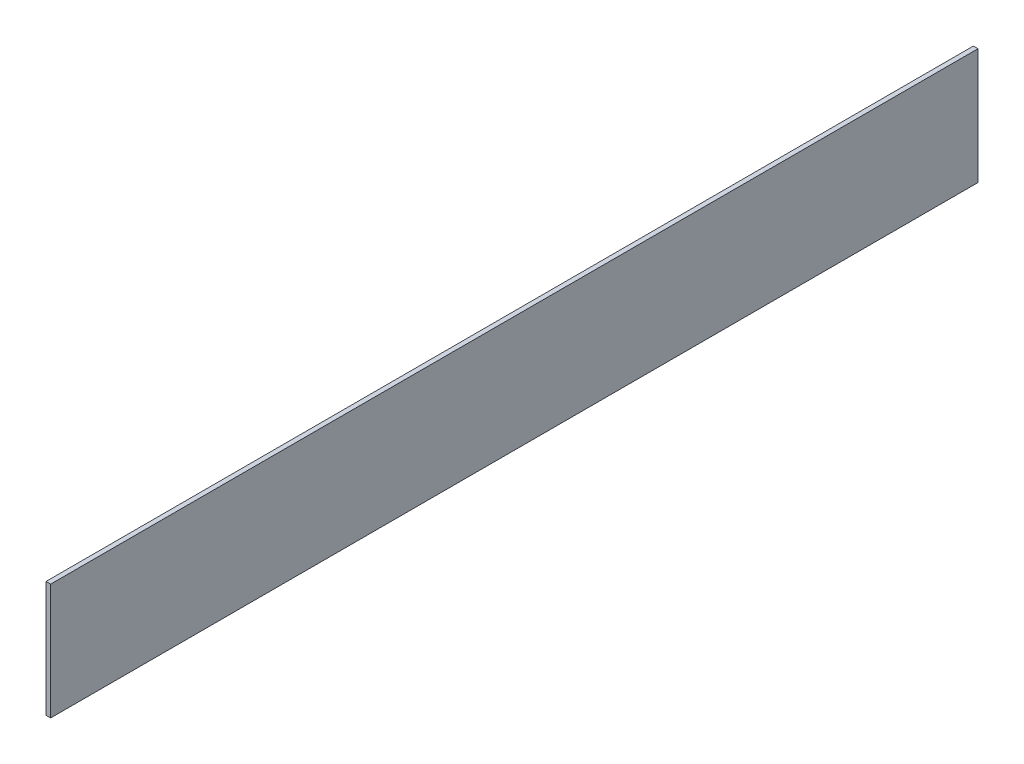
ISO-10303-21;
HEADER;
FILE_DESCRIPTION(('STEP AP214'),'2;1');
FILE_NAME('part.step','',(''),(''),'','','');
FILE_SCHEMA(('AUTOMOTIVE_DESIGN { 1 0 10303 214 1 1 1 1 }'));
ENDSEC;
DATA;
#1=APPLICATION_CONTEXT('core data for automotive mechanical design processes');
#2=APPLICATION_PROTOCOL_DEFINITION('international standard','automotive_design',2000,#1);
#3=PRODUCT_CONTEXT('',#1,'mechanical');
#4=PRODUCT('Part','Part','',(#3));
#5=PRODUCT_RELATED_PRODUCT_CATEGORY('part','',(#4));
#6=PRODUCT_DEFINITION_FORMATION('','',#4);
#7=PRODUCT_DEFINITION_CONTEXT('part definition',#1,'design');
#8=PRODUCT_DEFINITION('design','',#6,#7);
#9=PRODUCT_DEFINITION_SHAPE('','',#8);
#10=(LENGTH_UNIT() NAMED_UNIT(*) SI_UNIT(.MILLI.,.METRE.));
#11=(NAMED_UNIT(*) PLANE_ANGLE_UNIT() SI_UNIT($,.RADIAN.));
#12=(NAMED_UNIT(*) SI_UNIT($,.STERADIAN.) SOLID_ANGLE_UNIT());
#13=UNCERTAINTY_MEASURE_WITH_UNIT(LENGTH_MEASURE(1.E-05),#10,'distance_accuracy_value','');
#14=(GEOMETRIC_REPRESENTATION_CONTEXT(3) GLOBAL_UNCERTAINTY_ASSIGNED_CONTEXT((#13)) GLOBAL_UNIT_ASSIGNED_CONTEXT((#10,
#11,#12)) REPRESENTATION_CONTEXT('',''));
#15=CARTESIAN_POINT('',(0.,0.,0.));
#16=DIRECTION('',(0.,0.,1.));
#17=DIRECTION('',(1.,0.,0.));
#18=AXIS2_PLACEMENT_3D('',#15,#16,#17);
#19=CARTESIAN_POINT('',(0.,1.6,-320.));
#20=DIRECTION('',(-1.,0.,0.));
#21=DIRECTION('',(0.,0.,1.));
#22=AXIS2_PLACEMENT_3D('',#19,#20,#21);
#23=PLANE('',#22);
#24=DIRECTION('',(0.,-1.,0.));
#25=VECTOR('',#24,1.);
#26=CARTESIAN_POINT('',(0.,1.6,0.));
#27=LINE('',#26,#25);
#28=CARTESIAN_POINT('',(0.,41.6,0.));
#29=VERTEX_POINT('',#28);
#30=CARTESIAN_POINT('',(0.,1.6,0.));
#31=VERTEX_POINT('',#30);
#32=EDGE_CURVE('E103',#29,#31,#27,.T.);
#33=ORIENTED_EDGE('',*,*,#32,.F.);
#34=DIRECTION('',(0.,0.,1.));
#35=VECTOR('',#34,1.);
#36=CARTESIAN_POINT('',(0.,41.6,-320.));
#37=LINE('',#36,#35);
#38=CARTESIAN_POINT('',(0.,41.6,-320.));
#39=VERTEX_POINT('',#38);
#40=EDGE_CURVE('E11',#39,#29,#37,.T.);
#41=ORIENTED_EDGE('',*,*,#40,.F.);
#42=DIRECTION('',(0.,-1.,0.));
#43=VECTOR('',#42,1.);
#44=CARTESIAN_POINT('',(0.,1.6,-320.));
#45=LINE('',#44,#43);
#46=CARTESIAN_POINT('',(0.,1.6,-320.));
#47=VERTEX_POINT('',#46);
#48=EDGE_CURVE('E97',#39,#47,#45,.T.);
#49=ORIENTED_EDGE('',*,*,#48,.T.);
#50=DIRECTION('',(0.,0.,1.));
#51=VECTOR('',#50,1.);
#52=CARTESIAN_POINT('',(0.,1.6,-320.));
#53=LINE('',#52,#51);
#54=EDGE_CURVE('E42',#47,#31,#53,.T.);
#55=ORIENTED_EDGE('',*,*,#54,.T.);
#56=EDGE_LOOP('',(#33,#41,#49,#55));
#57=FACE_BOUND('',#56,.T.);
#58=ADVANCED_FACE('F39',(#57),#23,.T.);
#59=CARTESIAN_POINT('',(0.,41.6,-320.));
#60=DIRECTION('',(0.,1.,0.));
#61=DIRECTION('',(0.,0.,1.));
#62=AXIS2_PLACEMENT_3D('',#59,#60,#61);
#63=PLANE('',#62);
#64=DIRECTION('',(-1.,0.,0.));
#65=VECTOR('',#64,1.);
#66=CARTESIAN_POINT('',(0.,41.6,0.));
#67=LINE('',#66,#65);
#68=CARTESIAN_POINT('',(1.6,41.6,0.));
#69=VERTEX_POINT('',#68);
#70=EDGE_CURVE('E99',#69,#29,#67,.T.);
#71=ORIENTED_EDGE('',*,*,#70,.F.);
#72=DIRECTION('',(0.,0.,1.));
#73=VECTOR('',#72,1.);
#74=CARTESIAN_POINT('',(1.6,41.6,-320.));
#75=LINE('',#74,#73);
#76=CARTESIAN_POINT('',(1.6,41.6,-320.));
#77=VERTEX_POINT('',#76);
#78=EDGE_CURVE('E48',#77,#69,#75,.T.);
#79=ORIENTED_EDGE('',*,*,#78,.F.);
#80=DIRECTION('',(-1.,0.,0.));
#81=VECTOR('',#80,1.);
#82=CARTESIAN_POINT('',(0.,41.6,-320.));
#83=LINE('',#82,#81);
#84=EDGE_CURVE('E94',#77,#39,#83,.T.);
#85=ORIENTED_EDGE('',*,*,#84,.T.);
#86=ORIENTED_EDGE('',*,*,#40,.T.);
#87=EDGE_LOOP('',(#71,#79,#85,#86));
#88=FACE_BOUND('',#87,.T.);
#89=ADVANCED_FACE('F113',(#88),#63,.T.);
#90=CARTESIAN_POINT('',(1.6,1.6,-320.));
#91=DIRECTION('',(1.,0.,0.));
#92=DIRECTION('',(0.,0.,-1.));
#93=AXIS2_PLACEMENT_3D('',#90,#91,#92);
#94=PLANE('',#93);
#95=DIRECTION('',(0.,1.,0.));
#96=VECTOR('',#95,1.);
#97=CARTESIAN_POINT('',(1.6,1.6,0.));
#98=LINE('',#97,#96);
#99=CARTESIAN_POINT('',(1.6,1.6,0.));
#100=VERTEX_POINT('',#99);
#101=EDGE_CURVE('E89',#100,#69,#98,.T.);
#102=ORIENTED_EDGE('',*,*,#101,.F.);
#103=DIRECTION('',(0.,0.,1.));
#104=VECTOR('',#103,1.);
#105=CARTESIAN_POINT('',(1.6,1.6,-320.));
#106=LINE('',#105,#104);
#107=CARTESIAN_POINT('',(1.6,1.6,-320.));
#108=VERTEX_POINT('',#107);
#109=EDGE_CURVE('E84',#108,#100,#106,.T.);
#110=ORIENTED_EDGE('',*,*,#109,.F.);
#111=DIRECTION('',(0.,1.,0.));
#112=VECTOR('',#111,1.);
#113=CARTESIAN_POINT('',(1.6,1.6,-320.));
#114=LINE('',#113,#112);
#115=EDGE_CURVE('E87',#108,#77,#114,.T.);
#116=ORIENTED_EDGE('',*,*,#115,.T.);
#117=ORIENTED_EDGE('',*,*,#78,.T.);
#118=EDGE_LOOP('',(#102,#110,#116,#117));
#119=FACE_BOUND('',#118,.T.);
#120=ADVANCED_FACE('F86',(#119),#94,.T.);
#121=CARTESIAN_POINT('',(0.,1.6,-320.));
#122=DIRECTION('',(0.,-1.,0.));
#123=DIRECTION('',(0.,0.,-1.));
#124=AXIS2_PLACEMENT_3D('',#121,#122,#123);
#125=PLANE('',#124);
#126=DIRECTION('',(1.,0.,0.));
#127=VECTOR('',#126,1.);
#128=CARTESIAN_POINT('',(0.,1.6,0.));
#129=LINE('',#128,#127);
#130=EDGE_CURVE('E106',#31,#100,#129,.T.);
#131=ORIENTED_EDGE('',*,*,#130,.F.);
#132=ORIENTED_EDGE('',*,*,#54,.F.);
#133=DIRECTION('',(1.,0.,0.));
#134=VECTOR('',#133,1.);
#135=CARTESIAN_POINT('',(0.,1.6,-320.));
#136=LINE('',#135,#134);
#137=EDGE_CURVE('E93',#47,#108,#136,.T.);
#138=ORIENTED_EDGE('',*,*,#137,.T.);
#139=ORIENTED_EDGE('',*,*,#109,.T.);
#140=EDGE_LOOP('',(#131,#132,#138,#139));
#141=FACE_BOUND('',#140,.T.);
#142=ADVANCED_FACE('F96',(#141),#125,.T.);
#143=CARTESIAN_POINT('',(0.,0.,-320.));
#144=DIRECTION('',(0.,0.,-1.));
#145=DIRECTION('',(-1.,0.,0.));
#146=AXIS2_PLACEMENT_3D('',#143,#144,#145);
#147=PLANE('',#146);
#148=ORIENTED_EDGE('',*,*,#48,.F.);
#149=ORIENTED_EDGE('',*,*,#84,.F.);
#150=ORIENTED_EDGE('',*,*,#115,.F.);
#151=ORIENTED_EDGE('',*,*,#137,.F.);
#152=EDGE_LOOP('',(#148,#149,#150,#151));
#153=FACE_BOUND('',#152,.T.);
#154=ADVANCED_FACE('F92',(#153),#147,.T.);
#155=CARTESIAN_POINT('',(0.,0.,0.));
#156=DIRECTION('',(0.,0.,-1.));
#157=DIRECTION('',(-1.,0.,0.));
#158=AXIS2_PLACEMENT_3D('',#155,#156,#157);
#159=PLANE('',#158);
#160=ORIENTED_EDGE('',*,*,#32,.T.);
#161=ORIENTED_EDGE('',*,*,#130,.T.);
#162=ORIENTED_EDGE('',*,*,#101,.T.);
#163=ORIENTED_EDGE('',*,*,#70,.T.);
#164=EDGE_LOOP('',(#160,#161,#162,#163));
#165=FACE_BOUND('',#164,.T.);
#166=ADVANCED_FACE('F112',(#165),#159,.F.);
#167=CLOSED_SHELL('',(#58,#89,#120,#142,#154,#166));
#168=MANIFOLD_SOLID_BREP('B2',#167);
#169=ADVANCED_BREP_SHAPE_REPRESENTATION('',(#18,#168),#14);
#170=SHAPE_DEFINITION_REPRESENTATION(#9,#169);
ENDSEC;
END-ISO-10303-21;
